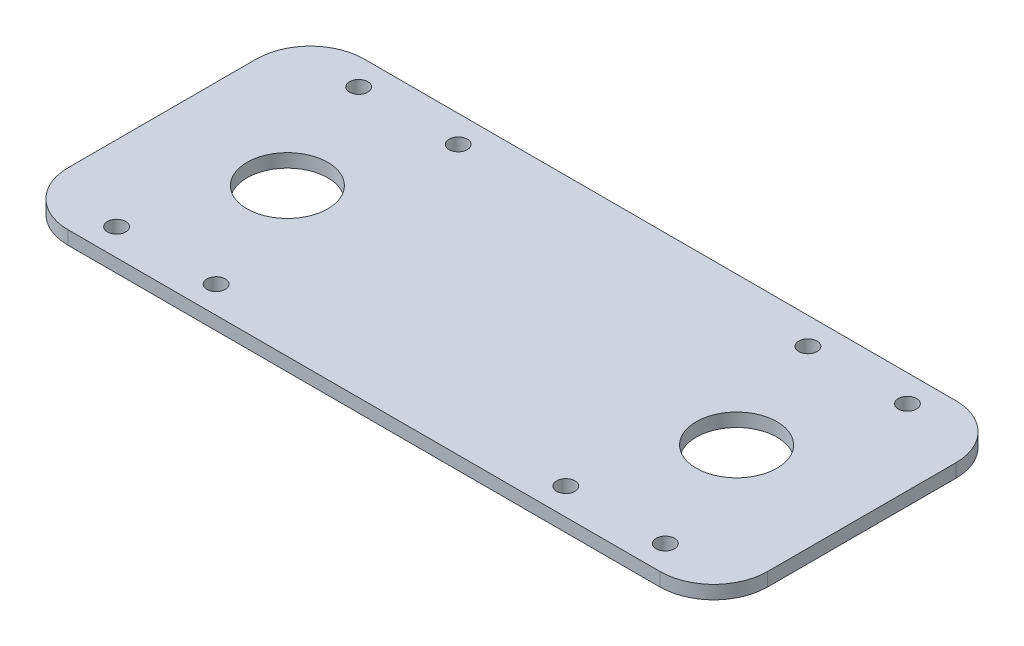
ISO-10303-21;
HEADER;
FILE_DESCRIPTION(('STEP AP214'),'2;1');
FILE_NAME('part.step','',(''),(''),'','','');
FILE_SCHEMA(('AUTOMOTIVE_DESIGN { 1 0 10303 214 1 1 1 1 }'));
ENDSEC;
DATA;
#1=APPLICATION_CONTEXT('core data for automotive mechanical design processes');
#2=APPLICATION_PROTOCOL_DEFINITION('international standard','automotive_design',2000,#1);
#3=PRODUCT_CONTEXT('',#1,'mechanical');
#4=PRODUCT('Part','Part','',(#3));
#5=PRODUCT_RELATED_PRODUCT_CATEGORY('part','',(#4));
#6=PRODUCT_DEFINITION_FORMATION('','',#4);
#7=PRODUCT_DEFINITION_CONTEXT('part definition',#1,'design');
#8=PRODUCT_DEFINITION('design','',#6,#7);
#9=PRODUCT_DEFINITION_SHAPE('','',#8);
#10=(LENGTH_UNIT() NAMED_UNIT(*) SI_UNIT(.MILLI.,.METRE.));
#11=(NAMED_UNIT(*) PLANE_ANGLE_UNIT() SI_UNIT($,.RADIAN.));
#12=(NAMED_UNIT(*) SI_UNIT($,.STERADIAN.) SOLID_ANGLE_UNIT());
#13=UNCERTAINTY_MEASURE_WITH_UNIT(LENGTH_MEASURE(1.E-05),#10,'distance_accuracy_value','');
#14=(GEOMETRIC_REPRESENTATION_CONTEXT(3) GLOBAL_UNCERTAINTY_ASSIGNED_CONTEXT((#13)) GLOBAL_UNIT_ASSIGNED_CONTEXT((#10,
#11,#12)) REPRESENTATION_CONTEXT('',''));
#15=CARTESIAN_POINT('',(0.,0.,0.));
#16=DIRECTION('',(0.,0.,1.));
#17=DIRECTION('',(1.,0.,0.));
#18=AXIS2_PLACEMENT_3D('',#15,#16,#17);
#19=CARTESIAN_POINT('',(10.,2.5,-45.));
#20=DIRECTION('',(0.,-1.,0.));
#21=DIRECTION('',(0.,0.,-1.));
#22=AXIS2_PLACEMENT_3D('',#19,#20,#21);
#23=CYLINDRICAL_SURFACE('',#22,10.);
#24=CARTESIAN_POINT('',(10.,0.,-45.));
#25=DIRECTION('',(0.,1.,0.));
#26=DIRECTION('',(0.,0.,1.));
#27=AXIS2_PLACEMENT_3D('',#24,#25,#26);
#28=CIRCLE('',#27,10.);
#29=CARTESIAN_POINT('',(10.0000000000001,0.,-55.));
#30=VERTEX_POINT('',#29);
#31=CARTESIAN_POINT('',(0.,0.,-44.9999999999999));
#32=VERTEX_POINT('',#31);
#33=EDGE_CURVE('E141',#30,#32,#28,.T.);
#34=ORIENTED_EDGE('',*,*,#33,.T.);
#35=DIRECTION('',(0.,-1.,0.));
#36=VECTOR('',#35,1.);
#37=CARTESIAN_POINT('',(0.,2.5,-44.9999999999999));
#38=LINE('',#37,#36);
#39=CARTESIAN_POINT('',(0.,2.5,-44.9999999999999));
#40=VERTEX_POINT('',#39);
#41=EDGE_CURVE('E11',#40,#32,#38,.T.);
#42=ORIENTED_EDGE('',*,*,#41,.F.);
#43=CARTESIAN_POINT('',(10.,2.5,-45.));
#44=DIRECTION('',(0.,1.,0.));
#45=DIRECTION('',(0.,0.,1.));
#46=AXIS2_PLACEMENT_3D('',#43,#44,#45);
#47=CIRCLE('',#46,10.);
#48=CARTESIAN_POINT('',(10.0000000000001,2.5,-55.));
#49=VERTEX_POINT('',#48);
#50=EDGE_CURVE('E156',#49,#40,#47,.T.);
#51=ORIENTED_EDGE('',*,*,#50,.F.);
#52=DIRECTION('',(0.,-1.,0.));
#53=VECTOR('',#52,1.);
#54=CARTESIAN_POINT('',(10.0000000000001,2.5,-55.));
#55=LINE('',#54,#53);
#56=EDGE_CURVE('E137',#49,#30,#55,.T.);
#57=ORIENTED_EDGE('',*,*,#56,.T.);
#58=EDGE_LOOP('',(#34,#42,#51,#57));
#59=FACE_BOUND('',#58,.T.);
#60=ADVANCED_FACE('F43',(#59),#23,.T.);
#61=CARTESIAN_POINT('',(0.,2.5,-10.0000000000001));
#62=DIRECTION('',(1.,0.,0.));
#63=DIRECTION('',(0.,0.,-1.));
#64=AXIS2_PLACEMENT_3D('',#61,#62,#63);
#65=PLANE('',#64);
#66=DIRECTION('',(0.,0.,1.));
#67=VECTOR('',#66,1.);
#68=CARTESIAN_POINT('',(0.,0.,-10.0000000000001));
#69=LINE('',#68,#67);
#70=CARTESIAN_POINT('',(0.,0.,-10.0000000000001));
#71=VERTEX_POINT('',#70);
#72=EDGE_CURVE('E144',#32,#71,#69,.T.);
#73=ORIENTED_EDGE('',*,*,#72,.T.);
#74=DIRECTION('',(0.,-1.,0.));
#75=VECTOR('',#74,1.);
#76=CARTESIAN_POINT('',(0.,2.5,-10.0000000000001));
#77=LINE('',#76,#75);
#78=CARTESIAN_POINT('',(0.,2.5,-10.0000000000001));
#79=VERTEX_POINT('',#78);
#80=EDGE_CURVE('E52',#79,#71,#77,.T.);
#81=ORIENTED_EDGE('',*,*,#80,.F.);
#82=DIRECTION('',(0.,0.,1.));
#83=VECTOR('',#82,1.);
#84=CARTESIAN_POINT('',(0.,2.5,-10.0000000000001));
#85=LINE('',#84,#83);
#86=EDGE_CURVE('E104',#40,#79,#85,.T.);
#87=ORIENTED_EDGE('',*,*,#86,.F.);
#88=ORIENTED_EDGE('',*,*,#41,.T.);
#89=EDGE_LOOP('',(#73,#81,#87,#88));
#90=FACE_BOUND('',#89,.T.);
#91=ADVANCED_FACE('F263',(#90),#65,.F.);
#92=CARTESIAN_POINT('',(10.,2.5,-10.));
#93=DIRECTION('',(0.,-1.,0.));
#94=DIRECTION('',(0.,0.,-1.));
#95=AXIS2_PLACEMENT_3D('',#92,#93,#94);
#96=CYLINDRICAL_SURFACE('',#95,10.);
#97=CARTESIAN_POINT('',(10.,0.,-10.));
#98=DIRECTION('',(0.,1.,0.));
#99=DIRECTION('',(0.,0.,1.));
#100=AXIS2_PLACEMENT_3D('',#97,#98,#99);
#101=CIRCLE('',#100,10.);
#102=CARTESIAN_POINT('',(10.0000000000001,0.,0.));
#103=VERTEX_POINT('',#102);
#104=EDGE_CURVE('E147',#71,#103,#101,.T.);
#105=ORIENTED_EDGE('',*,*,#104,.T.);
#106=DIRECTION('',(0.,-1.,0.));
#107=VECTOR('',#106,1.);
#108=CARTESIAN_POINT('',(10.0000000000001,2.5,0.));
#109=LINE('',#108,#107);
#110=CARTESIAN_POINT('',(10.0000000000001,2.5,0.));
#111=VERTEX_POINT('',#110);
#112=EDGE_CURVE('E163',#111,#103,#109,.T.);
#113=ORIENTED_EDGE('',*,*,#112,.F.);
#114=CARTESIAN_POINT('',(10.,2.5,-10.));
#115=DIRECTION('',(0.,1.,0.));
#116=DIRECTION('',(0.,0.,1.));
#117=AXIS2_PLACEMENT_3D('',#114,#115,#116);
#118=CIRCLE('',#117,10.);
#119=EDGE_CURVE('E230',#79,#111,#118,.T.);
#120=ORIENTED_EDGE('',*,*,#119,.F.);
#121=ORIENTED_EDGE('',*,*,#80,.T.);
#122=EDGE_LOOP('',(#105,#113,#120,#121));
#123=FACE_BOUND('',#122,.T.);
#124=ADVANCED_FACE('F267',(#123),#96,.T.);
#125=CARTESIAN_POINT('',(10.0000000000001,2.5,0.));
#126=DIRECTION('',(0.,0.,-1.));
#127=DIRECTION('',(-1.,0.,0.));
#128=AXIS2_PLACEMENT_3D('',#125,#126,#127);
#129=PLANE('',#128);
#130=DIRECTION('',(1.,0.,0.));
#131=VECTOR('',#130,1.);
#132=CARTESIAN_POINT('',(10.0000000000001,0.,0.));
#133=LINE('',#132,#131);
#134=CARTESIAN_POINT('',(120.,0.,0.));
#135=VERTEX_POINT('',#134);
#136=EDGE_CURVE('E149',#103,#135,#133,.T.);
#137=ORIENTED_EDGE('',*,*,#136,.T.);
#138=DIRECTION('',(0.,-1.,0.));
#139=VECTOR('',#138,1.);
#140=CARTESIAN_POINT('',(120.,2.5,0.));
#141=LINE('',#140,#139);
#142=CARTESIAN_POINT('',(120.,2.5,0.));
#143=VERTEX_POINT('',#142);
#144=EDGE_CURVE('E160',#143,#135,#141,.T.);
#145=ORIENTED_EDGE('',*,*,#144,.F.);
#146=DIRECTION('',(1.,0.,0.));
#147=VECTOR('',#146,1.);
#148=CARTESIAN_POINT('',(10.0000000000001,2.5,0.));
#149=LINE('',#148,#147);
#150=EDGE_CURVE('E232',#111,#143,#149,.T.);
#151=ORIENTED_EDGE('',*,*,#150,.F.);
#152=ORIENTED_EDGE('',*,*,#112,.T.);
#153=EDGE_LOOP('',(#137,#145,#151,#152));
#154=FACE_BOUND('',#153,.T.);
#155=ADVANCED_FACE('F238',(#154),#129,.F.);
#156=CARTESIAN_POINT('',(120.,2.5,-10.));
#157=DIRECTION('',(0.,-1.,0.));
#158=DIRECTION('',(0.,0.,-1.));
#159=AXIS2_PLACEMENT_3D('',#156,#157,#158);
#160=CYLINDRICAL_SURFACE('',#159,10.);
#161=CARTESIAN_POINT('',(120.,0.,-10.));
#162=DIRECTION('',(0.,1.,0.));
#163=DIRECTION('',(0.,0.,-1.));
#164=AXIS2_PLACEMENT_3D('',#161,#162,#163);
#165=CIRCLE('',#164,10.);
#166=CARTESIAN_POINT('',(130.,0.,-10.0000000000001));
#167=VERTEX_POINT('',#166);
#168=EDGE_CURVE('E151',#135,#167,#165,.T.);
#169=ORIENTED_EDGE('',*,*,#168,.T.);
#170=DIRECTION('',(0.,-1.,0.));
#171=VECTOR('',#170,1.);
#172=CARTESIAN_POINT('',(130.,2.5,-10.0000000000001));
#173=LINE('',#172,#171);
#174=CARTESIAN_POINT('',(130.,2.5,-10.0000000000001));
#175=VERTEX_POINT('',#174);
#176=EDGE_CURVE('E132',#175,#167,#173,.T.);
#177=ORIENTED_EDGE('',*,*,#176,.F.);
#178=CARTESIAN_POINT('',(120.,2.5,-10.));
#179=DIRECTION('',(0.,1.,0.));
#180=DIRECTION('',(0.,0.,-1.));
#181=AXIS2_PLACEMENT_3D('',#178,#179,#180);
#182=CIRCLE('',#181,10.);
#183=EDGE_CURVE('E123',#143,#175,#182,.T.);
#184=ORIENTED_EDGE('',*,*,#183,.F.);
#185=ORIENTED_EDGE('',*,*,#144,.T.);
#186=EDGE_LOOP('',(#169,#177,#184,#185));
#187=FACE_BOUND('',#186,.T.);
#188=ADVANCED_FACE('F242',(#187),#160,.T.);
#189=CARTESIAN_POINT('',(130.,2.5,-10.0000000000001));
#190=DIRECTION('',(-1.,0.,0.));
#191=DIRECTION('',(0.,0.,1.));
#192=AXIS2_PLACEMENT_3D('',#189,#190,#191);
#193=PLANE('',#192);
#194=DIRECTION('',(0.,0.,-1.));
#195=VECTOR('',#194,1.);
#196=CARTESIAN_POINT('',(130.,0.,-10.0000000000001));
#197=LINE('',#196,#195);
#198=CARTESIAN_POINT('',(130.,0.,-44.9999999999999));
#199=VERTEX_POINT('',#198);
#200=EDGE_CURVE('E131',#167,#199,#197,.T.);
#201=ORIENTED_EDGE('',*,*,#200,.T.);
#202=DIRECTION('',(0.,-1.,0.));
#203=VECTOR('',#202,1.);
#204=CARTESIAN_POINT('',(130.,2.5,-44.9999999999999));
#205=LINE('',#204,#203);
#206=CARTESIAN_POINT('',(130.,2.5,-44.9999999999999));
#207=VERTEX_POINT('',#206);
#208=EDGE_CURVE('E128',#207,#199,#205,.T.);
#209=ORIENTED_EDGE('',*,*,#208,.F.);
#210=DIRECTION('',(0.,0.,-1.));
#211=VECTOR('',#210,1.);
#212=CARTESIAN_POINT('',(130.,2.5,-10.0000000000001));
#213=LINE('',#212,#211);
#214=EDGE_CURVE('E117',#175,#207,#213,.T.);
#215=ORIENTED_EDGE('',*,*,#214,.F.);
#216=ORIENTED_EDGE('',*,*,#176,.T.);
#217=EDGE_LOOP('',(#201,#209,#215,#216));
#218=FACE_BOUND('',#217,.T.);
#219=ADVANCED_FACE('F129',(#218),#193,.F.);
#220=CARTESIAN_POINT('',(120.,2.5,-45.));
#221=DIRECTION('',(0.,-1.,0.));
#222=DIRECTION('',(0.,0.,-1.));
#223=AXIS2_PLACEMENT_3D('',#220,#221,#222);
#224=CYLINDRICAL_SURFACE('',#223,10.);
#225=CARTESIAN_POINT('',(120.,0.,-45.));
#226=DIRECTION('',(0.,1.,0.));
#227=DIRECTION('',(0.,0.,-1.));
#228=AXIS2_PLACEMENT_3D('',#225,#226,#227);
#229=CIRCLE('',#228,10.);
#230=CARTESIAN_POINT('',(120.,0.,-55.));
#231=VERTEX_POINT('',#230);
#232=EDGE_CURVE('E90',#199,#231,#229,.T.);
#233=ORIENTED_EDGE('',*,*,#232,.T.);
#234=DIRECTION('',(0.,-1.,0.));
#235=VECTOR('',#234,1.);
#236=CARTESIAN_POINT('',(120.,2.5,-55.));
#237=LINE('',#236,#235);
#238=CARTESIAN_POINT('',(120.,2.5,-55.));
#239=VERTEX_POINT('',#238);
#240=EDGE_CURVE('E133',#239,#231,#237,.T.);
#241=ORIENTED_EDGE('',*,*,#240,.F.);
#242=CARTESIAN_POINT('',(120.,2.5,-45.));
#243=DIRECTION('',(0.,1.,0.));
#244=DIRECTION('',(0.,0.,-1.));
#245=AXIS2_PLACEMENT_3D('',#242,#243,#244);
#246=CIRCLE('',#245,10.);
#247=EDGE_CURVE('E121',#207,#239,#246,.T.);
#248=ORIENTED_EDGE('',*,*,#247,.F.);
#249=ORIENTED_EDGE('',*,*,#208,.T.);
#250=EDGE_LOOP('',(#233,#241,#248,#249));
#251=FACE_BOUND('',#250,.T.);
#252=ADVANCED_FACE('F135',(#251),#224,.T.);
#253=CARTESIAN_POINT('',(10.0000000000001,2.5,-55.));
#254=DIRECTION('',(0.,0.,1.));
#255=DIRECTION('',(1.,0.,0.));
#256=AXIS2_PLACEMENT_3D('',#253,#254,#255);
#257=PLANE('',#256);
#258=DIRECTION('',(-1.,0.,0.));
#259=VECTOR('',#258,1.);
#260=CARTESIAN_POINT('',(10.0000000000001,0.,-55.));
#261=LINE('',#260,#259);
#262=EDGE_CURVE('E96',#231,#30,#261,.T.);
#263=ORIENTED_EDGE('',*,*,#262,.T.);
#264=ORIENTED_EDGE('',*,*,#56,.F.);
#265=DIRECTION('',(-1.,0.,0.));
#266=VECTOR('',#265,1.);
#267=CARTESIAN_POINT('',(10.0000000000001,2.5,-55.));
#268=LINE('',#267,#266);
#269=EDGE_CURVE('E61',#239,#49,#268,.T.);
#270=ORIENTED_EDGE('',*,*,#269,.F.);
#271=ORIENTED_EDGE('',*,*,#240,.T.);
#272=EDGE_LOOP('',(#263,#264,#270,#271));
#273=FACE_BOUND('',#272,.T.);
#274=ADVANCED_FACE('F250',(#273),#257,.F.);
#275=CARTESIAN_POINT('',(10.,2.5,-45.));
#276=DIRECTION('',(0.,1.,0.));
#277=DIRECTION('',(0.,0.,1.));
#278=AXIS2_PLACEMENT_3D('',#275,#276,#277);
#279=PLANE('',#278);
#280=CARTESIAN_POINT('',(23.25,2.5,-27.5));
#281=DIRECTION('',(0.,1.,0.));
#282=DIRECTION('',(0.,0.,1.));
#283=AXIS2_PLACEMENT_3D('',#280,#281,#282);
#284=CIRCLE('',#283,7.5);
#285=CARTESIAN_POINT('',(23.25,2.5,-20.));
#286=VERTEX_POINT('',#285);
#287=EDGE_CURVE('E183',#286,#286,#284,.T.);
#288=ORIENTED_EDGE('',*,*,#287,.F.);
#289=EDGE_LOOP('',(#288));
#290=FACE_BOUND('',#289,.T.);
#291=CARTESIAN_POINT('',(106.75,2.5,-27.5));
#292=DIRECTION('',(0.,1.,0.));
#293=DIRECTION('',(0.,0.,-1.));
#294=AXIS2_PLACEMENT_3D('',#291,#292,#293);
#295=CIRCLE('',#294,7.50000000000001);
#296=CARTESIAN_POINT('',(106.75,2.5,-35.));
#297=VERTEX_POINT('',#296);
#298=EDGE_CURVE('E189',#297,#297,#295,.T.);
#299=ORIENTED_EDGE('',*,*,#298,.F.);
#300=EDGE_LOOP('',(#299));
#301=FACE_BOUND('',#300,.T.);
#302=CARTESIAN_POINT('',(97.5,2.5,-50.));
#303=DIRECTION('',(0.,1.,0.));
#304=DIRECTION('',(0.,0.,-1.));
#305=AXIS2_PLACEMENT_3D('',#302,#303,#304);
#306=CIRCLE('',#305,1.7);
#307=CARTESIAN_POINT('',(97.5,2.5,-51.7));
#308=VERTEX_POINT('',#307);
#309=EDGE_CURVE('E187',#308,#308,#306,.T.);
#310=ORIENTED_EDGE('',*,*,#309,.F.);
#311=EDGE_LOOP('',(#310));
#312=FACE_BOUND('',#311,.T.);
#313=CARTESIAN_POINT('',(97.5,2.5,-4.99999999999999));
#314=DIRECTION('',(0.,1.,0.));
#315=DIRECTION('',(0.,0.,1.));
#316=AXIS2_PLACEMENT_3D('',#313,#314,#315);
#317=CIRCLE('',#316,1.69999999999999);
#318=CARTESIAN_POINT('',(97.5,2.5,-3.3));
#319=VERTEX_POINT('',#318);
#320=EDGE_CURVE('E199',#319,#319,#317,.T.);
#321=ORIENTED_EDGE('',*,*,#320,.F.);
#322=EDGE_LOOP('',(#321));
#323=FACE_BOUND('',#322,.T.);
#324=CARTESIAN_POINT('',(32.5,2.5,-5.));
#325=DIRECTION('',(0.,1.,0.));
#326=DIRECTION('',(0.,0.,-1.));
#327=AXIS2_PLACEMENT_3D('',#324,#325,#326);
#328=CIRCLE('',#327,1.69999999999999);
#329=CARTESIAN_POINT('',(32.5,2.5,-6.7));
#330=VERTEX_POINT('',#329);
#331=EDGE_CURVE('E196',#330,#330,#328,.T.);
#332=ORIENTED_EDGE('',*,*,#331,.F.);
#333=EDGE_LOOP('',(#332));
#334=FACE_BOUND('',#333,.T.);
#335=CARTESIAN_POINT('',(32.5,2.5,-50.));
#336=DIRECTION('',(0.,1.,0.));
#337=DIRECTION('',(0.,0.,1.));
#338=AXIS2_PLACEMENT_3D('',#335,#336,#337);
#339=CIRCLE('',#338,1.7);
#340=CARTESIAN_POINT('',(32.5,2.5,-48.3));
#341=VERTEX_POINT('',#340);
#342=EDGE_CURVE('E172',#341,#341,#339,.T.);
#343=ORIENTED_EDGE('',*,*,#342,.F.);
#344=EDGE_LOOP('',(#343));
#345=FACE_BOUND('',#344,.T.);
#346=CARTESIAN_POINT('',(116.,2.5,-50.));
#347=DIRECTION('',(0.,1.,0.));
#348=DIRECTION('',(0.,0.,-1.));
#349=AXIS2_PLACEMENT_3D('',#346,#347,#348);
#350=CIRCLE('',#349,1.7);
#351=CARTESIAN_POINT('',(116.,2.5,-51.7));
#352=VERTEX_POINT('',#351);
#353=EDGE_CURVE('E180',#352,#352,#350,.T.);
#354=ORIENTED_EDGE('',*,*,#353,.F.);
#355=EDGE_LOOP('',(#354));
#356=FACE_BOUND('',#355,.T.);
#357=CARTESIAN_POINT('',(116.,2.5,-4.99999999999997));
#358=DIRECTION('',(0.,1.,0.));
#359=DIRECTION('',(0.,0.,-1.));
#360=AXIS2_PLACEMENT_3D('',#357,#358,#359);
#361=CIRCLE('',#360,1.7);
#362=CARTESIAN_POINT('',(116.,2.5,-6.69999999999997));
#363=VERTEX_POINT('',#362);
#364=EDGE_CURVE('E209',#363,#363,#361,.T.);
#365=ORIENTED_EDGE('',*,*,#364,.F.);
#366=EDGE_LOOP('',(#365));
#367=FACE_BOUND('',#366,.T.);
#368=CARTESIAN_POINT('',(14.,2.5,-50.));
#369=DIRECTION('',(0.,1.,0.));
#370=DIRECTION('',(0.,0.,1.));
#371=AXIS2_PLACEMENT_3D('',#368,#369,#370);
#372=CIRCLE('',#371,1.7);
#373=CARTESIAN_POINT('',(14.,2.5,-48.3));
#374=VERTEX_POINT('',#373);
#375=EDGE_CURVE('E215',#374,#374,#372,.T.);
#376=ORIENTED_EDGE('',*,*,#375,.F.);
#377=EDGE_LOOP('',(#376));
#378=FACE_BOUND('',#377,.T.);
#379=CARTESIAN_POINT('',(14.,2.5,-5.));
#380=DIRECTION('',(0.,1.,0.));
#381=DIRECTION('',(0.,0.,1.));
#382=AXIS2_PLACEMENT_3D('',#379,#380,#381);
#383=CIRCLE('',#382,1.7);
#384=CARTESIAN_POINT('',(14.,2.5,-3.3));
#385=VERTEX_POINT('',#384);
#386=EDGE_CURVE('E221',#385,#385,#383,.T.);
#387=ORIENTED_EDGE('',*,*,#386,.F.);
#388=EDGE_LOOP('',(#387));
#389=FACE_BOUND('',#388,.T.);
#390=ORIENTED_EDGE('',*,*,#50,.T.);
#391=ORIENTED_EDGE('',*,*,#86,.T.);
#392=ORIENTED_EDGE('',*,*,#119,.T.);
#393=ORIENTED_EDGE('',*,*,#150,.T.);
#394=ORIENTED_EDGE('',*,*,#183,.T.);
#395=ORIENTED_EDGE('',*,*,#214,.T.);
#396=ORIENTED_EDGE('',*,*,#247,.T.);
#397=ORIENTED_EDGE('',*,*,#269,.T.);
#398=EDGE_LOOP('',(#390,#391,#392,#393,#394,#395,#396,#397));
#399=FACE_BOUND('',#398,.T.);
#400=ADVANCED_FACE('F119',(#290,#301,#312,#323,#334,#345,#356,#367,#378,#389,#399),#279,.T.);
#401=CARTESIAN_POINT('',(10.,0.,-45.));
#402=DIRECTION('',(0.,1.,0.));
#403=DIRECTION('',(0.,0.,1.));
#404=AXIS2_PLACEMENT_3D('',#401,#402,#403);
#405=PLANE('',#404);
#406=CARTESIAN_POINT('',(23.25,0.,-27.5));
#407=DIRECTION('',(0.,1.,0.));
#408=DIRECTION('',(0.,0.,1.));
#409=AXIS2_PLACEMENT_3D('',#406,#407,#408);
#410=CIRCLE('',#409,7.5);
#411=CARTESIAN_POINT('',(23.25,0.,-20.));
#412=VERTEX_POINT('',#411);
#413=EDGE_CURVE('E46',#412,#412,#410,.T.);
#414=ORIENTED_EDGE('',*,*,#413,.T.);
#415=EDGE_LOOP('',(#414));
#416=FACE_BOUND('',#415,.T.);
#417=CARTESIAN_POINT('',(106.75,0.,-27.5));
#418=DIRECTION('',(0.,1.,0.));
#419=DIRECTION('',(0.,0.,1.));
#420=AXIS2_PLACEMENT_3D('',#417,#418,#419);
#421=CIRCLE('',#420,7.50000000000001);
#422=CARTESIAN_POINT('',(106.75,0.,-20.));
#423=VERTEX_POINT('',#422);
#424=EDGE_CURVE('E181',#423,#423,#421,.T.);
#425=ORIENTED_EDGE('',*,*,#424,.T.);
#426=EDGE_LOOP('',(#425));
#427=FACE_BOUND('',#426,.T.);
#428=CARTESIAN_POINT('',(97.5,0.,-50.));
#429=DIRECTION('',(0.,1.,0.));
#430=DIRECTION('',(0.,0.,1.));
#431=AXIS2_PLACEMENT_3D('',#428,#429,#430);
#432=CIRCLE('',#431,1.7);
#433=CARTESIAN_POINT('',(97.5,0.,-48.3));
#434=VERTEX_POINT('',#433);
#435=EDGE_CURVE('E178',#434,#434,#432,.T.);
#436=ORIENTED_EDGE('',*,*,#435,.T.);
#437=EDGE_LOOP('',(#436));
#438=FACE_BOUND('',#437,.T.);
#439=CARTESIAN_POINT('',(97.5,0.,-4.99999999999999));
#440=DIRECTION('',(0.,1.,0.));
#441=DIRECTION('',(0.,0.,1.));
#442=AXIS2_PLACEMENT_3D('',#439,#440,#441);
#443=CIRCLE('',#442,1.69999999999999);
#444=CARTESIAN_POINT('',(97.5,0.,-3.3));
#445=VERTEX_POINT('',#444);
#446=EDGE_CURVE('E175',#445,#445,#443,.T.);
#447=ORIENTED_EDGE('',*,*,#446,.T.);
#448=EDGE_LOOP('',(#447));
#449=FACE_BOUND('',#448,.T.);
#450=CARTESIAN_POINT('',(32.5,0.,-5.));
#451=DIRECTION('',(0.,1.,0.));
#452=DIRECTION('',(0.,0.,1.));
#453=AXIS2_PLACEMENT_3D('',#450,#451,#452);
#454=CIRCLE('',#453,1.69999999999999);
#455=CARTESIAN_POINT('',(32.5,0.,-3.30000000000001));
#456=VERTEX_POINT('',#455);
#457=EDGE_CURVE('E171',#456,#456,#454,.T.);
#458=ORIENTED_EDGE('',*,*,#457,.T.);
#459=EDGE_LOOP('',(#458));
#460=FACE_BOUND('',#459,.T.);
#461=CARTESIAN_POINT('',(32.5,0.,-50.));
#462=DIRECTION('',(0.,1.,0.));
#463=DIRECTION('',(0.,0.,1.));
#464=AXIS2_PLACEMENT_3D('',#461,#462,#463);
#465=CIRCLE('',#464,1.7);
#466=CARTESIAN_POINT('',(32.5,0.,-48.3));
#467=VERTEX_POINT('',#466);
#468=EDGE_CURVE('E168',#467,#467,#465,.T.);
#469=ORIENTED_EDGE('',*,*,#468,.T.);
#470=EDGE_LOOP('',(#469));
#471=FACE_BOUND('',#470,.T.);
#472=CARTESIAN_POINT('',(116.,0.,-50.));
#473=DIRECTION('',(0.,1.,0.));
#474=DIRECTION('',(0.,0.,-1.));
#475=AXIS2_PLACEMENT_3D('',#472,#473,#474);
#476=CIRCLE('',#475,1.7);
#477=CARTESIAN_POINT('',(116.,0.,-51.7));
#478=VERTEX_POINT('',#477);
#479=EDGE_CURVE('E206',#478,#478,#476,.T.);
#480=ORIENTED_EDGE('',*,*,#479,.T.);
#481=EDGE_LOOP('',(#480));
#482=FACE_BOUND('',#481,.T.);
#483=CARTESIAN_POINT('',(116.,0.,-4.99999999999997));
#484=DIRECTION('',(0.,1.,0.));
#485=DIRECTION('',(0.,0.,-1.));
#486=AXIS2_PLACEMENT_3D('',#483,#484,#485);
#487=CIRCLE('',#486,1.7);
#488=CARTESIAN_POINT('',(116.,0.,-6.69999999999997));
#489=VERTEX_POINT('',#488);
#490=EDGE_CURVE('E212',#489,#489,#487,.T.);
#491=ORIENTED_EDGE('',*,*,#490,.T.);
#492=EDGE_LOOP('',(#491));
#493=FACE_BOUND('',#492,.T.);
#494=CARTESIAN_POINT('',(14.,0.,-50.));
#495=DIRECTION('',(0.,1.,0.));
#496=DIRECTION('',(0.,0.,1.));
#497=AXIS2_PLACEMENT_3D('',#494,#495,#496);
#498=CIRCLE('',#497,1.7);
#499=CARTESIAN_POINT('',(14.,0.,-48.3));
#500=VERTEX_POINT('',#499);
#501=EDGE_CURVE('E218',#500,#500,#498,.T.);
#502=ORIENTED_EDGE('',*,*,#501,.T.);
#503=EDGE_LOOP('',(#502));
#504=FACE_BOUND('',#503,.T.);
#505=CARTESIAN_POINT('',(14.,0.,-5.));
#506=DIRECTION('',(0.,1.,0.));
#507=DIRECTION('',(0.,0.,1.));
#508=AXIS2_PLACEMENT_3D('',#505,#506,#507);
#509=CIRCLE('',#508,1.7);
#510=CARTESIAN_POINT('',(14.,0.,-3.3));
#511=VERTEX_POINT('',#510);
#512=EDGE_CURVE('E145',#511,#511,#509,.T.);
#513=ORIENTED_EDGE('',*,*,#512,.T.);
#514=EDGE_LOOP('',(#513));
#515=FACE_BOUND('',#514,.T.);
#516=ORIENTED_EDGE('',*,*,#33,.F.);
#517=ORIENTED_EDGE('',*,*,#262,.F.);
#518=ORIENTED_EDGE('',*,*,#232,.F.);
#519=ORIENTED_EDGE('',*,*,#200,.F.);
#520=ORIENTED_EDGE('',*,*,#168,.F.);
#521=ORIENTED_EDGE('',*,*,#136,.F.);
#522=ORIENTED_EDGE('',*,*,#104,.F.);
#523=ORIENTED_EDGE('',*,*,#72,.F.);
#524=EDGE_LOOP('',(#516,#517,#518,#519,#520,#521,#522,#523));
#525=FACE_BOUND('',#524,.T.);
#526=ADVANCED_FACE('F245',(#416,#427,#438,#449,#460,#471,#482,#493,#504,#515,#525),#405,.F.);
#527=CARTESIAN_POINT('',(14.,0.,-5.));
#528=DIRECTION('',(0.,1.,0.));
#529=DIRECTION('',(0.,0.,1.));
#530=AXIS2_PLACEMENT_3D('',#527,#528,#529);
#531=CYLINDRICAL_SURFACE('',#530,1.7);
#532=ORIENTED_EDGE('',*,*,#512,.F.);
#533=EDGE_LOOP('',(#532));
#534=FACE_BOUND('',#533,.T.);
#535=ORIENTED_EDGE('',*,*,#386,.T.);
#536=EDGE_LOOP('',(#535));
#537=FACE_BOUND('',#536,.T.);
#538=ADVANCED_FACE('F297',(#534,#537),#531,.F.);
#539=CARTESIAN_POINT('',(14.,0.,-50.));
#540=DIRECTION('',(0.,1.,0.));
#541=DIRECTION('',(0.,0.,1.));
#542=AXIS2_PLACEMENT_3D('',#539,#540,#541);
#543=CYLINDRICAL_SURFACE('',#542,1.7);
#544=ORIENTED_EDGE('',*,*,#501,.F.);
#545=EDGE_LOOP('',(#544));
#546=FACE_BOUND('',#545,.T.);
#547=ORIENTED_EDGE('',*,*,#375,.T.);
#548=EDGE_LOOP('',(#547));
#549=FACE_BOUND('',#548,.T.);
#550=ADVANCED_FACE('F301',(#546,#549),#543,.F.);
#551=CARTESIAN_POINT('',(116.,0.,-4.99999999999997));
#552=DIRECTION('',(0.,1.,0.));
#553=DIRECTION('',(0.,0.,1.));
#554=AXIS2_PLACEMENT_3D('',#551,#552,#553);
#555=CYLINDRICAL_SURFACE('',#554,1.7);
#556=ORIENTED_EDGE('',*,*,#490,.F.);
#557=EDGE_LOOP('',(#556));
#558=FACE_BOUND('',#557,.T.);
#559=ORIENTED_EDGE('',*,*,#364,.T.);
#560=EDGE_LOOP('',(#559));
#561=FACE_BOUND('',#560,.T.);
#562=ADVANCED_FACE('F311',(#558,#561),#555,.F.);
#563=CARTESIAN_POINT('',(116.,0.,-50.));
#564=DIRECTION('',(0.,1.,0.));
#565=DIRECTION('',(0.,0.,1.));
#566=AXIS2_PLACEMENT_3D('',#563,#564,#565);
#567=CYLINDRICAL_SURFACE('',#566,1.7);
#568=ORIENTED_EDGE('',*,*,#479,.F.);
#569=EDGE_LOOP('',(#568));
#570=FACE_BOUND('',#569,.T.);
#571=ORIENTED_EDGE('',*,*,#353,.T.);
#572=EDGE_LOOP('',(#571));
#573=FACE_BOUND('',#572,.T.);
#574=ADVANCED_FACE('F320',(#570,#573),#567,.F.);
#575=CARTESIAN_POINT('',(32.5,-7.5,-50.));
#576=DIRECTION('',(0.,1.,0.));
#577=DIRECTION('',(0.,0.,1.));
#578=AXIS2_PLACEMENT_3D('',#575,#576,#577);
#579=CYLINDRICAL_SURFACE('',#578,1.7);
#580=ORIENTED_EDGE('',*,*,#342,.T.);
#581=EDGE_LOOP('',(#580));
#582=FACE_BOUND('',#581,.T.);
#583=ORIENTED_EDGE('',*,*,#468,.F.);
#584=EDGE_LOOP('',(#583));
#585=FACE_BOUND('',#584,.T.);
#586=ADVANCED_FACE('F329',(#582,#585),#579,.F.);
#587=CARTESIAN_POINT('',(32.5,-7.5,-5.));
#588=DIRECTION('',(0.,1.,0.));
#589=DIRECTION('',(0.,0.,1.));
#590=AXIS2_PLACEMENT_3D('',#587,#588,#589);
#591=CYLINDRICAL_SURFACE('',#590,1.69999999999999);
#592=ORIENTED_EDGE('',*,*,#331,.T.);
#593=EDGE_LOOP('',(#592));
#594=FACE_BOUND('',#593,.T.);
#595=ORIENTED_EDGE('',*,*,#457,.F.);
#596=EDGE_LOOP('',(#595));
#597=FACE_BOUND('',#596,.T.);
#598=ADVANCED_FACE('F338',(#594,#597),#591,.F.);
#599=CARTESIAN_POINT('',(97.5,-7.5,-4.99999999999999));
#600=DIRECTION('',(0.,1.,0.));
#601=DIRECTION('',(0.,0.,1.));
#602=AXIS2_PLACEMENT_3D('',#599,#600,#601);
#603=CYLINDRICAL_SURFACE('',#602,1.69999999999999);
#604=ORIENTED_EDGE('',*,*,#320,.T.);
#605=EDGE_LOOP('',(#604));
#606=FACE_BOUND('',#605,.T.);
#607=ORIENTED_EDGE('',*,*,#446,.F.);
#608=EDGE_LOOP('',(#607));
#609=FACE_BOUND('',#608,.T.);
#610=ADVANCED_FACE('F347',(#606,#609),#603,.F.);
#611=CARTESIAN_POINT('',(97.5,-7.5,-50.));
#612=DIRECTION('',(0.,1.,0.));
#613=DIRECTION('',(0.,0.,1.));
#614=AXIS2_PLACEMENT_3D('',#611,#612,#613);
#615=CYLINDRICAL_SURFACE('',#614,1.7);
#616=ORIENTED_EDGE('',*,*,#309,.T.);
#617=EDGE_LOOP('',(#616));
#618=FACE_BOUND('',#617,.T.);
#619=ORIENTED_EDGE('',*,*,#435,.F.);
#620=EDGE_LOOP('',(#619));
#621=FACE_BOUND('',#620,.T.);
#622=ADVANCED_FACE('F356',(#618,#621),#615,.F.);
#623=CARTESIAN_POINT('',(106.75,-7.5,-27.5));
#624=DIRECTION('',(0.,1.,0.));
#625=DIRECTION('',(0.,0.,1.));
#626=AXIS2_PLACEMENT_3D('',#623,#624,#625);
#627=CYLINDRICAL_SURFACE('',#626,7.50000000000001);
#628=ORIENTED_EDGE('',*,*,#298,.T.);
#629=EDGE_LOOP('',(#628));
#630=FACE_BOUND('',#629,.T.);
#631=ORIENTED_EDGE('',*,*,#424,.F.);
#632=EDGE_LOOP('',(#631));
#633=FACE_BOUND('',#632,.T.);
#634=ADVANCED_FACE('F364',(#630,#633),#627,.F.);
#635=CARTESIAN_POINT('',(23.25,-7.5,-27.5));
#636=DIRECTION('',(0.,1.,0.));
#637=DIRECTION('',(0.,0.,1.));
#638=AXIS2_PLACEMENT_3D('',#635,#636,#637);
#639=CYLINDRICAL_SURFACE('',#638,7.5);
#640=ORIENTED_EDGE('',*,*,#287,.T.);
#641=EDGE_LOOP('',(#640));
#642=FACE_BOUND('',#641,.T.);
#643=ORIENTED_EDGE('',*,*,#413,.F.);
#644=EDGE_LOOP('',(#643));
#645=FACE_BOUND('',#644,.T.);
#646=ADVANCED_FACE('F381',(#642,#645),#639,.F.);
#647=CLOSED_SHELL('',(#60,#91,#124,#155,#188,#219,#252,#274,#400,#526,#538,#550,#562,#574,#586,
#598,#610,#622,#634,#646));
#648=MANIFOLD_SOLID_BREP('B2',#647);
#649=ADVANCED_BREP_SHAPE_REPRESENTATION('',(#18,#648),#14);
#650=SHAPE_DEFINITION_REPRESENTATION(#9,#649);
ENDSEC;
END-ISO-10303-21;
